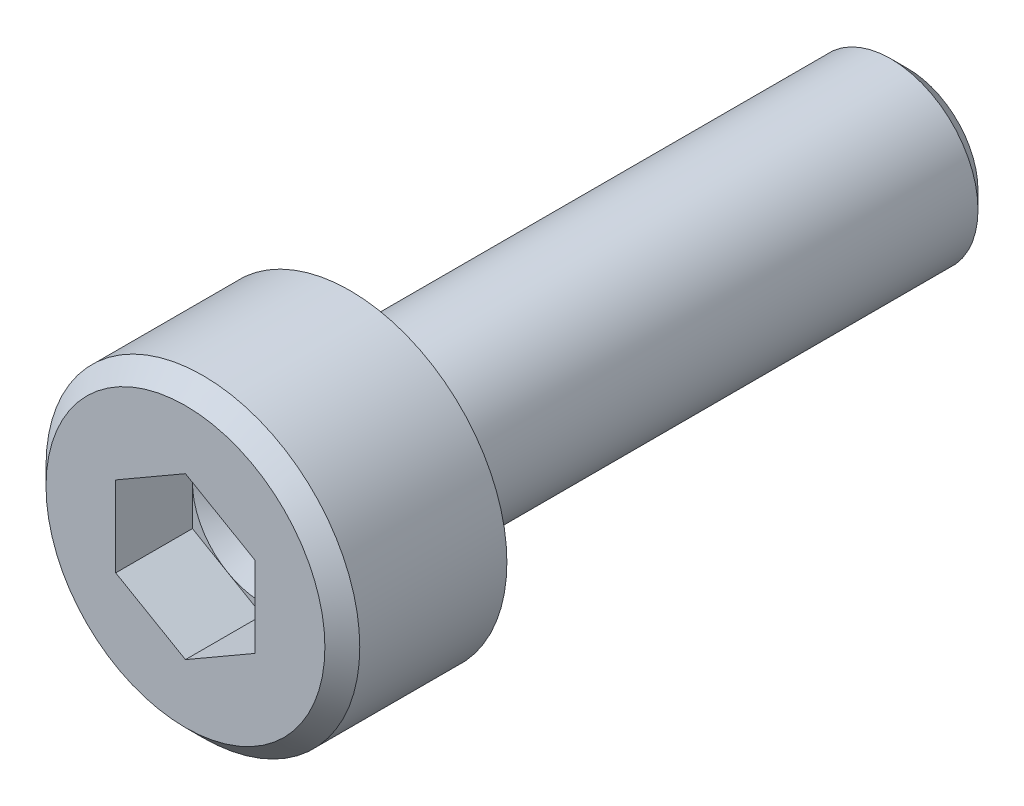
ISO-10303-21;
HEADER;
FILE_DESCRIPTION(('STEP AP214'),'2;1');
FILE_NAME('part.step','',(''),(''),'','','');
FILE_SCHEMA(('AUTOMOTIVE_DESIGN { 1 0 10303 214 1 1 1 1 }'));
ENDSEC;
DATA;
#1=APPLICATION_CONTEXT('core data for automotive mechanical design processes');
#2=APPLICATION_PROTOCOL_DEFINITION('international standard','automotive_design',2000,#1);
#3=PRODUCT_CONTEXT('',#1,'mechanical');
#4=PRODUCT('Part','Part','',(#3));
#5=PRODUCT_RELATED_PRODUCT_CATEGORY('part','',(#4));
#6=PRODUCT_DEFINITION_FORMATION('','',#4);
#7=PRODUCT_DEFINITION_CONTEXT('part definition',#1,'design');
#8=PRODUCT_DEFINITION('design','',#6,#7);
#9=PRODUCT_DEFINITION_SHAPE('','',#8);
#10=(LENGTH_UNIT() NAMED_UNIT(*) SI_UNIT(.MILLI.,.METRE.));
#11=(NAMED_UNIT(*) PLANE_ANGLE_UNIT() SI_UNIT($,.RADIAN.));
#12=(NAMED_UNIT(*) SI_UNIT($,.STERADIAN.) SOLID_ANGLE_UNIT());
#13=UNCERTAINTY_MEASURE_WITH_UNIT(LENGTH_MEASURE(1.E-05),#10,'distance_accuracy_value','');
#14=(GEOMETRIC_REPRESENTATION_CONTEXT(3) GLOBAL_UNCERTAINTY_ASSIGNED_CONTEXT((#13)) GLOBAL_UNIT_ASSIGNED_CONTEXT((#10,
#11,#12)) REPRESENTATION_CONTEXT('',''));
#15=CARTESIAN_POINT('',(0.,0.,0.));
#16=DIRECTION('',(0.,0.,1.));
#17=DIRECTION('',(1.,0.,0.));
#18=AXIS2_PLACEMENT_3D('',#15,#16,#17);
#19=CARTESIAN_POINT('',(27.5,-9.,3.25999999995474));
#20=DIRECTION('',(0.,0.,1.));
#21=DIRECTION('',(1.,0.,0.));
#22=AXIS2_PLACEMENT_3D('',#19,#20,#21);
#23=CONICAL_SURFACE('',#22,0.999999999934061,1.04719755119586);
#24=CARTESIAN_POINT('',(27.5,-9.,2.68264973084342));
#25=VERTEX_POINT('',#24);
#26=VERTEX_LOOP('',#25);
#27=FACE_BOUND('',#26,.T.);
#28=CARTESIAN_POINT('',(27.5,-9.,3.25999999998756));
#29=DIRECTION('',(0.,0.,1.));
#30=DIRECTION('',(1.,0.,0.));
#31=AXIS2_PLACEMENT_3D('',#28,#29,#30);
#32=CIRCLE('',#31,0.999999999990903);
#33=CARTESIAN_POINT('',(26.5000000000045,-9.,3.25999999999378));
#34=VERTEX_POINT('',#33);
#35=CARTESIAN_POINT('',(27.,-9.86602540378444,3.25999999998958));
#36=VERTEX_POINT('',#35);
#37=EDGE_CURVE('E19',#34,#36,#32,.T.);
#38=ORIENTED_EDGE('',*,*,#37,.T.);
#39=CARTESIAN_POINT('',(27.5,-9.,3.25999999998756));
#40=DIRECTION('',(0.,0.,1.));
#41=DIRECTION('',(1.,0.,0.));
#42=AXIS2_PLACEMENT_3D('',#39,#40,#41);
#43=CIRCLE('',#42,0.999999999990903);
#44=CARTESIAN_POINT('',(27.9999999999977,-9.86602540378052,3.25999999999378));
#45=VERTEX_POINT('',#44);
#46=EDGE_CURVE('E93',#36,#45,#43,.T.);
#47=ORIENTED_EDGE('',*,*,#46,.T.);
#48=CARTESIAN_POINT('',(27.5,-9.,3.25999999998756));
#49=DIRECTION('',(0.,0.,1.));
#50=DIRECTION('',(1.,0.,0.));
#51=AXIS2_PLACEMENT_3D('',#48,#49,#50);
#52=CIRCLE('',#51,0.999999999990904);
#53=CARTESIAN_POINT('',(28.4999999999955,-9.,3.25999999999378));
#54=VERTEX_POINT('',#53);
#55=EDGE_CURVE('E102',#45,#54,#52,.T.);
#56=ORIENTED_EDGE('',*,*,#55,.T.);
#57=CARTESIAN_POINT('',(27.5,-9.,3.25999999998756));
#58=DIRECTION('',(0.,0.,1.));
#59=DIRECTION('',(1.,0.,0.));
#60=AXIS2_PLACEMENT_3D('',#57,#58,#59);
#61=CIRCLE('',#60,0.999999999990905);
#62=CARTESIAN_POINT('',(27.9999999999977,-8.1339745962195,3.25999999999378));
#63=VERTEX_POINT('',#62);
#64=EDGE_CURVE('E204',#54,#63,#61,.T.);
#65=ORIENTED_EDGE('',*,*,#64,.T.);
#66=CARTESIAN_POINT('',(27.5,-9.,3.25999999998756));
#67=DIRECTION('',(0.,0.,1.));
#68=DIRECTION('',(1.,0.,0.));
#69=AXIS2_PLACEMENT_3D('',#66,#67,#68);
#70=CIRCLE('',#69,0.999999999990905);
#71=CARTESIAN_POINT('',(27.0000000000023,-8.1339745962195,3.25999999999378));
#72=VERTEX_POINT('',#71);
#73=EDGE_CURVE('E207',#63,#72,#70,.T.);
#74=ORIENTED_EDGE('',*,*,#73,.T.);
#75=CARTESIAN_POINT('',(27.5,-9.,3.25999999998756));
#76=DIRECTION('',(0.,0.,1.));
#77=DIRECTION('',(1.,0.,0.));
#78=AXIS2_PLACEMENT_3D('',#75,#76,#77);
#79=CIRCLE('',#78,0.999999999990904);
#80=EDGE_CURVE('E88',#72,#34,#79,.T.);
#81=ORIENTED_EDGE('',*,*,#80,.T.);
#82=EDGE_LOOP('',(#38,#47,#56,#65,#74,#81));
#83=FACE_BOUND('',#82,.T.);
#84=ADVANCED_FACE('F16',(#27,#83),#23,.F.);
#85=CARTESIAN_POINT('',(27.5,-9.,3.26));
#86=DIRECTION('',(0.,0.,-1.));
#87=DIRECTION('',(-1.,0.,0.));
#88=AXIS2_PLACEMENT_3D('',#85,#86,#87);
#89=PLANE('',#88);
#90=DIRECTION('',(0.,1.,0.));
#91=VECTOR('',#90,1.);
#92=CARTESIAN_POINT('',(26.5,-8.42264973081037,3.26));
#93=LINE('',#92,#91);
#94=CARTESIAN_POINT('',(26.5,-9.57735026918963,3.26));
#95=VERTEX_POINT('',#94);
#96=EDGE_CURVE('E111',#34,#95,#93,.F.);
#97=ORIENTED_EDGE('',*,*,#96,.T.);
#98=DIRECTION('',(0.866025403784439,-0.5,0.));
#99=VECTOR('',#98,1.);
#100=CARTESIAN_POINT('',(26.5,-9.57735026918963,3.26));
#101=LINE('',#100,#99);
#102=EDGE_CURVE('E108',#95,#36,#101,.T.);
#103=ORIENTED_EDGE('',*,*,#102,.T.);
#104=ORIENTED_EDGE('',*,*,#37,.F.);
#105=EDGE_LOOP('',(#97,#103,#104));
#106=FACE_BOUND('',#105,.T.);
#107=ADVANCED_FACE('F109',(#106),#89,.F.);
#108=CARTESIAN_POINT('',(27.5,-9.,3.26));
#109=DIRECTION('',(0.,0.,-1.));
#110=DIRECTION('',(-1.,0.,0.));
#111=AXIS2_PLACEMENT_3D('',#108,#109,#110);
#112=PLANE('',#111);
#113=DIRECTION('',(-0.866025403784439,-0.5,0.));
#114=VECTOR('',#113,1.);
#115=CARTESIAN_POINT('',(27.5,-7.84529946162075,3.26));
#116=LINE('',#115,#114);
#117=CARTESIAN_POINT('',(26.5,-8.42264973081037,3.26));
#118=VERTEX_POINT('',#117);
#119=EDGE_CURVE('E174',#72,#118,#116,.T.);
#120=ORIENTED_EDGE('',*,*,#119,.T.);
#121=DIRECTION('',(0.,1.,0.));
#122=VECTOR('',#121,1.);
#123=CARTESIAN_POINT('',(26.5,-8.42264973081037,3.26));
#124=LINE('',#123,#122);
#125=EDGE_CURVE('E176',#118,#34,#124,.F.);
#126=ORIENTED_EDGE('',*,*,#125,.T.);
#127=ORIENTED_EDGE('',*,*,#80,.F.);
#128=EDGE_LOOP('',(#120,#126,#127));
#129=FACE_BOUND('',#128,.T.);
#130=ADVANCED_FACE('F211',(#129),#112,.F.);
#131=CARTESIAN_POINT('',(27.5,-9.,3.26));
#132=DIRECTION('',(0.,0.,-1.));
#133=DIRECTION('',(-1.,0.,0.));
#134=AXIS2_PLACEMENT_3D('',#131,#132,#133);
#135=PLANE('',#134);
#136=ORIENTED_EDGE('',*,*,#73,.F.);
#137=DIRECTION('',(-0.866025403784439,0.5,0.));
#138=VECTOR('',#137,1.);
#139=CARTESIAN_POINT('',(28.5,-8.42264973081037,3.26));
#140=LINE('',#139,#138);
#141=CARTESIAN_POINT('',(27.5,-7.84529946162075,3.26));
#142=VERTEX_POINT('',#141);
#143=EDGE_CURVE('E161',#63,#142,#140,.T.);
#144=ORIENTED_EDGE('',*,*,#143,.T.);
#145=DIRECTION('',(-0.866025403784439,-0.5,0.));
#146=VECTOR('',#145,1.);
#147=CARTESIAN_POINT('',(27.5,-7.84529946162075,3.26));
#148=LINE('',#147,#146);
#149=EDGE_CURVE('E163',#142,#72,#148,.T.);
#150=ORIENTED_EDGE('',*,*,#149,.T.);
#151=EDGE_LOOP('',(#136,#144,#150));
#152=FACE_BOUND('',#151,.T.);
#153=ADVANCED_FACE('F215',(#152),#135,.F.);
#154=CARTESIAN_POINT('',(27.5,-9.,3.26));
#155=DIRECTION('',(0.,0.,-1.));
#156=DIRECTION('',(-1.,0.,0.));
#157=AXIS2_PLACEMENT_3D('',#154,#155,#156);
#158=PLANE('',#157);
#159=DIRECTION('',(0.,1.,0.));
#160=VECTOR('',#159,1.);
#161=CARTESIAN_POINT('',(28.5,-9.57735026918963,3.26));
#162=LINE('',#161,#160);
#163=CARTESIAN_POINT('',(28.5,-8.42264973081037,3.26));
#164=VERTEX_POINT('',#163);
#165=EDGE_CURVE('E148',#54,#164,#162,.T.);
#166=ORIENTED_EDGE('',*,*,#165,.T.);
#167=DIRECTION('',(-0.866025403784439,0.5,0.));
#168=VECTOR('',#167,1.);
#169=CARTESIAN_POINT('',(28.5,-8.42264973081037,3.26));
#170=LINE('',#169,#168);
#171=EDGE_CURVE('E150',#164,#63,#170,.T.);
#172=ORIENTED_EDGE('',*,*,#171,.T.);
#173=ORIENTED_EDGE('',*,*,#64,.F.);
#174=EDGE_LOOP('',(#166,#172,#173));
#175=FACE_BOUND('',#174,.T.);
#176=ADVANCED_FACE('F255',(#175),#158,.F.);
#177=CARTESIAN_POINT('',(27.5,-9.,3.26));
#178=DIRECTION('',(0.,0.,-1.));
#179=DIRECTION('',(-1.,0.,0.));
#180=AXIS2_PLACEMENT_3D('',#177,#178,#179);
#181=PLANE('',#180);
#182=DIRECTION('',(0.866025403784439,0.5,0.));
#183=VECTOR('',#182,1.);
#184=CARTESIAN_POINT('',(27.5,-10.1547005383793,3.26));
#185=LINE('',#184,#183);
#186=CARTESIAN_POINT('',(28.5,-9.57735026918966,3.26));
#187=VERTEX_POINT('',#186);
#188=EDGE_CURVE('E141',#45,#187,#185,.T.);
#189=ORIENTED_EDGE('',*,*,#188,.T.);
#190=DIRECTION('',(0.,1.,0.));
#191=VECTOR('',#190,1.);
#192=CARTESIAN_POINT('',(28.5,-9.57735026918963,3.26));
#193=LINE('',#192,#191);
#194=EDGE_CURVE('E138',#187,#54,#193,.T.);
#195=ORIENTED_EDGE('',*,*,#194,.T.);
#196=ORIENTED_EDGE('',*,*,#55,.F.);
#197=EDGE_LOOP('',(#189,#195,#196));
#198=FACE_BOUND('',#197,.T.);
#199=ADVANCED_FACE('F250',(#198),#181,.F.);
#200=CARTESIAN_POINT('',(27.5,-9.,3.26));
#201=DIRECTION('',(0.,0.,-1.));
#202=DIRECTION('',(-1.,0.,0.));
#203=AXIS2_PLACEMENT_3D('',#200,#201,#202);
#204=PLANE('',#203);
#205=ORIENTED_EDGE('',*,*,#46,.F.);
#206=DIRECTION('',(0.866025403784439,-0.5,0.));
#207=VECTOR('',#206,1.);
#208=CARTESIAN_POINT('',(26.5,-9.57735026918963,3.26));
#209=LINE('',#208,#207);
#210=CARTESIAN_POINT('',(27.5,-10.1547005383793,3.26));
#211=VERTEX_POINT('',#210);
#212=EDGE_CURVE('E96',#36,#211,#209,.T.);
#213=ORIENTED_EDGE('',*,*,#212,.T.);
#214=DIRECTION('',(0.866025403784439,0.5,0.));
#215=VECTOR('',#214,1.);
#216=CARTESIAN_POINT('',(27.5,-10.1547005383793,3.26));
#217=LINE('',#216,#215);
#218=EDGE_CURVE('E99',#211,#45,#217,.T.);
#219=ORIENTED_EDGE('',*,*,#218,.T.);
#220=EDGE_LOOP('',(#205,#213,#219));
#221=FACE_BOUND('',#220,.T.);
#222=ADVANCED_FACE('F94',(#221),#204,.F.);
#223=CARTESIAN_POINT('',(26.5,-9.57735026918963,4.36));
#224=DIRECTION('',(-0.5,-0.866025403784439,0.));
#225=DIRECTION('',(0.866025403784439,-0.5,0.));
#226=AXIS2_PLACEMENT_3D('',#223,#224,#225);
#227=PLANE('',#226);
#228=DIRECTION('',(0.,0.,1.));
#229=VECTOR('',#228,1.);
#230=CARTESIAN_POINT('',(26.5,-9.57735026918963,4.36));
#231=LINE('',#230,#229);
#232=CARTESIAN_POINT('',(26.5,-9.57735026918963,4.36));
#233=VERTEX_POINT('',#232);
#234=EDGE_CURVE('E180',#95,#233,#231,.T.);
#235=ORIENTED_EDGE('',*,*,#234,.T.);
#236=DIRECTION('',(-0.866025403784422,0.500000000000028,0.));
#237=VECTOR('',#236,1.);
#238=CARTESIAN_POINT('',(27.5,-10.1547005383793,4.36));
#239=LINE('',#238,#237);
#240=CARTESIAN_POINT('',(27.5,-10.1547005383793,4.36));
#241=VERTEX_POINT('',#240);
#242=EDGE_CURVE('E125',#241,#233,#239,.T.);
#243=ORIENTED_EDGE('',*,*,#242,.F.);
#244=DIRECTION('',(0.,0.,1.));
#245=VECTOR('',#244,1.);
#246=CARTESIAN_POINT('',(27.5,-10.1547005383793,4.36));
#247=LINE('',#246,#245);
#248=EDGE_CURVE('E117',#241,#211,#247,.F.);
#249=ORIENTED_EDGE('',*,*,#248,.T.);
#250=ORIENTED_EDGE('',*,*,#212,.F.);
#251=ORIENTED_EDGE('',*,*,#102,.F.);
#252=EDGE_LOOP('',(#235,#243,#249,#250,#251));
#253=FACE_BOUND('',#252,.T.);
#254=ADVANCED_FACE('F115',(#253),#227,.F.);
#255=CARTESIAN_POINT('',(26.5,-8.42264973081037,4.36));
#256=DIRECTION('',(-1.,0.,0.));
#257=DIRECTION('',(0.,0.,1.));
#258=AXIS2_PLACEMENT_3D('',#255,#256,#257);
#259=PLANE('',#258);
#260=DIRECTION('',(0.,0.,1.));
#261=VECTOR('',#260,1.);
#262=CARTESIAN_POINT('',(26.5,-8.42264973081038,4.36));
#263=LINE('',#262,#261);
#264=CARTESIAN_POINT('',(26.5,-8.42264973081037,4.36));
#265=VERTEX_POINT('',#264);
#266=EDGE_CURVE('E168',#118,#265,#263,.T.);
#267=ORIENTED_EDGE('',*,*,#266,.T.);
#268=DIRECTION('',(0.,1.,0.));
#269=VECTOR('',#268,1.);
#270=CARTESIAN_POINT('',(26.5,-10.,4.36));
#271=LINE('',#270,#269);
#272=EDGE_CURVE('E128',#233,#265,#271,.T.);
#273=ORIENTED_EDGE('',*,*,#272,.F.);
#274=ORIENTED_EDGE('',*,*,#234,.F.);
#275=ORIENTED_EDGE('',*,*,#96,.F.);
#276=ORIENTED_EDGE('',*,*,#125,.F.);
#277=EDGE_LOOP('',(#267,#273,#274,#275,#276));
#278=FACE_BOUND('',#277,.T.);
#279=ADVANCED_FACE('F227',(#278),#259,.F.);
#280=CARTESIAN_POINT('',(27.5,-7.84529946162075,4.36));
#281=DIRECTION('',(-0.5,0.866025403784439,0.));
#282=DIRECTION('',(-0.866025403784439,-0.5,0.));
#283=AXIS2_PLACEMENT_3D('',#280,#281,#282);
#284=PLANE('',#283);
#285=DIRECTION('',(0.,0.,1.));
#286=VECTOR('',#285,1.);
#287=CARTESIAN_POINT('',(27.5,-7.84529946162074,4.36));
#288=LINE('',#287,#286);
#289=CARTESIAN_POINT('',(27.5,-7.84529946162075,4.36));
#290=VERTEX_POINT('',#289);
#291=EDGE_CURVE('E155',#142,#290,#288,.T.);
#292=ORIENTED_EDGE('',*,*,#291,.T.);
#293=DIRECTION('',(0.866025403784441,0.499999999999996,0.));
#294=VECTOR('',#293,1.);
#295=CARTESIAN_POINT('',(26.5,-8.42264973081037,4.36));
#296=LINE('',#295,#294);
#297=EDGE_CURVE('E223',#265,#290,#296,.T.);
#298=ORIENTED_EDGE('',*,*,#297,.F.);
#299=ORIENTED_EDGE('',*,*,#266,.F.);
#300=ORIENTED_EDGE('',*,*,#119,.F.);
#301=ORIENTED_EDGE('',*,*,#149,.F.);
#302=EDGE_LOOP('',(#292,#298,#299,#300,#301));
#303=FACE_BOUND('',#302,.T.);
#304=ADVANCED_FACE('F220',(#303),#284,.F.);
#305=CARTESIAN_POINT('',(28.5,-8.42264973081037,4.36));
#306=DIRECTION('',(0.5,0.866025403784439,0.));
#307=DIRECTION('',(-0.866025403784439,0.5,0.));
#308=AXIS2_PLACEMENT_3D('',#305,#306,#307);
#309=PLANE('',#308);
#310=DIRECTION('',(0.,0.,-1.));
#311=VECTOR('',#310,1.);
#312=CARTESIAN_POINT('',(28.5,-8.42264973081037,4.36));
#313=LINE('',#312,#311);
#314=CARTESIAN_POINT('',(28.5,-8.42264973081037,4.36));
#315=VERTEX_POINT('',#314);
#316=EDGE_CURVE('E142',#164,#315,#313,.F.);
#317=ORIENTED_EDGE('',*,*,#316,.T.);
#318=DIRECTION('',(0.866025403784441,-0.499999999999996,0.));
#319=VECTOR('',#318,1.);
#320=CARTESIAN_POINT('',(27.5,-7.84529946162075,4.36));
#321=LINE('',#320,#319);
#322=EDGE_CURVE('E235',#290,#315,#321,.T.);
#323=ORIENTED_EDGE('',*,*,#322,.F.);
#324=ORIENTED_EDGE('',*,*,#291,.F.);
#325=ORIENTED_EDGE('',*,*,#143,.F.);
#326=ORIENTED_EDGE('',*,*,#171,.F.);
#327=EDGE_LOOP('',(#317,#323,#324,#325,#326));
#328=FACE_BOUND('',#327,.T.);
#329=ADVANCED_FACE('F257',(#328),#309,.F.);
#330=CARTESIAN_POINT('',(28.5,-9.57735026918963,4.36));
#331=DIRECTION('',(1.,0.,0.));
#332=DIRECTION('',(0.,0.,-1.));
#333=AXIS2_PLACEMENT_3D('',#330,#331,#332);
#334=PLANE('',#333);
#335=DIRECTION('',(0.,0.,1.));
#336=VECTOR('',#335,1.);
#337=CARTESIAN_POINT('',(28.5,-9.57735026918966,4.36));
#338=LINE('',#337,#336);
#339=CARTESIAN_POINT('',(28.5,-9.57735026918964,4.36));
#340=VERTEX_POINT('',#339);
#341=EDGE_CURVE('E34',#187,#340,#338,.T.);
#342=ORIENTED_EDGE('',*,*,#341,.T.);
#343=DIRECTION('',(0.,1.,0.));
#344=VECTOR('',#343,1.);
#345=CARTESIAN_POINT('',(28.5,-10.,4.36));
#346=LINE('',#345,#344);
#347=EDGE_CURVE('E135',#315,#340,#346,.F.);
#348=ORIENTED_EDGE('',*,*,#347,.F.);
#349=ORIENTED_EDGE('',*,*,#316,.F.);
#350=ORIENTED_EDGE('',*,*,#165,.F.);
#351=ORIENTED_EDGE('',*,*,#194,.F.);
#352=EDGE_LOOP('',(#342,#348,#349,#350,#351));
#353=FACE_BOUND('',#352,.T.);
#354=ADVANCED_FACE('F252',(#353),#334,.F.);
#355=CARTESIAN_POINT('',(27.5,-10.1547005383793,4.36));
#356=DIRECTION('',(0.5,-0.866025403784439,0.));
#357=DIRECTION('',(0.866025403784439,0.5,0.));
#358=AXIS2_PLACEMENT_3D('',#355,#356,#357);
#359=PLANE('',#358);
#360=ORIENTED_EDGE('',*,*,#248,.F.);
#361=DIRECTION('',(-0.866025403784422,-0.500000000000028,0.));
#362=VECTOR('',#361,1.);
#363=CARTESIAN_POINT('',(28.5,-9.57735026918963,4.36));
#364=LINE('',#363,#362);
#365=EDGE_CURVE('E131',#340,#241,#364,.T.);
#366=ORIENTED_EDGE('',*,*,#365,.F.);
#367=ORIENTED_EDGE('',*,*,#341,.F.);
#368=ORIENTED_EDGE('',*,*,#188,.F.);
#369=ORIENTED_EDGE('',*,*,#218,.F.);
#370=EDGE_LOOP('',(#360,#366,#367,#368,#369));
#371=FACE_BOUND('',#370,.T.);
#372=ADVANCED_FACE('F230',(#371),#359,.F.);
#373=CARTESIAN_POINT('',(27.5,-10.,4.36));
#374=DIRECTION('',(0.,0.,1.));
#375=DIRECTION('',(1.,0.,0.));
#376=AXIS2_PLACEMENT_3D('',#373,#374,#375);
#377=PLANE('',#376);
#378=CARTESIAN_POINT('',(27.5,-9.,4.36000000001968));
#379=DIRECTION('',(0.,0.,-1.));
#380=DIRECTION('',(-1.,0.,0.));
#381=AXIS2_PLACEMENT_3D('',#378,#379,#380);
#382=CIRCLE('',#381,1.99999999996726);
#383=CARTESIAN_POINT('',(25.5000000000327,-9.,4.36000000001968));
#384=VERTEX_POINT('',#383);
#385=EDGE_CURVE('E134',#384,#384,#382,.T.);
#386=ORIENTED_EDGE('',*,*,#385,.F.);
#387=EDGE_LOOP('',(#386));
#388=FACE_BOUND('',#387,.T.);
#389=ORIENTED_EDGE('',*,*,#347,.T.);
#390=ORIENTED_EDGE('',*,*,#365,.T.);
#391=ORIENTED_EDGE('',*,*,#242,.T.);
#392=ORIENTED_EDGE('',*,*,#272,.T.);
#393=ORIENTED_EDGE('',*,*,#297,.T.);
#394=ORIENTED_EDGE('',*,*,#322,.T.);
#395=EDGE_LOOP('',(#389,#390,#391,#392,#393,#394));
#396=FACE_BOUND('',#395,.T.);
#397=ADVANCED_FACE('F232',(#388,#396),#377,.T.);
#398=CARTESIAN_POINT('',(27.5,-9.,4.11000000002559));
#399=DIRECTION('',(0.,0.,-1.));
#400=DIRECTION('',(-1.,0.,0.));
#401=AXIS2_PLACEMENT_3D('',#398,#399,#400);
#402=CONICAL_SURFACE('',#401,2.24999999996135,0.785398163397448);
#403=ORIENTED_EDGE('',*,*,#385,.T.);
#404=EDGE_LOOP('',(#403));
#405=FACE_BOUND('',#404,.T.);
#406=CARTESIAN_POINT('',(27.5,-9.,4.11));
#407=DIRECTION('',(0.,0.,-1.));
#408=DIRECTION('',(-1.,0.,0.));
#409=AXIS2_PLACEMENT_3D('',#406,#407,#408);
#410=CIRCLE('',#409,2.25);
#411=CARTESIAN_POINT('',(25.25,-9.,4.11));
#412=VERTEX_POINT('',#411);
#413=EDGE_CURVE('E200',#412,#412,#410,.T.);
#414=ORIENTED_EDGE('',*,*,#413,.F.);
#415=EDGE_LOOP('',(#414));
#416=FACE_BOUND('',#415,.T.);
#417=ADVANCED_FACE('F291',(#405,#416),#402,.T.);
#418=CARTESIAN_POINT('',(27.5,-9.50325,-6.));
#419=DIRECTION('',(0.,0.,-1.));
#420=DIRECTION('',(-1.,0.,0.));
#421=AXIS2_PLACEMENT_3D('',#418,#419,#420);
#422=PLANE('',#421);
#423=CARTESIAN_POINT('',(27.5,-9.,-5.99999999997181));
#424=DIRECTION('',(0.,0.,1.));
#425=DIRECTION('',(1.,0.,0.));
#426=AXIS2_PLACEMENT_3D('',#423,#424,#425);
#427=CIRCLE('',#426,1.00650000003134);
#428=CARTESIAN_POINT('',(28.5065000000313,-9.,-5.99999999997181));
#429=VERTEX_POINT('',#428);
#430=EDGE_CURVE('E197',#429,#429,#427,.T.);
#431=ORIENTED_EDGE('',*,*,#430,.F.);
#432=EDGE_LOOP('',(#431));
#433=FACE_BOUND('',#432,.T.);
#434=ADVANCED_FACE('F287',(#433),#422,.T.);
#435=CARTESIAN_POINT('',(27.5,-9.,3.055));
#436=DIRECTION('',(0.,0.,-1.));
#437=DIRECTION('',(-1.,0.,0.));
#438=AXIS2_PLACEMENT_3D('',#435,#436,#437);
#439=CYLINDRICAL_SURFACE('',#438,2.25);
#440=ORIENTED_EDGE('',*,*,#413,.T.);
#441=EDGE_LOOP('',(#440));
#442=FACE_BOUND('',#441,.T.);
#443=CARTESIAN_POINT('',(27.5,-9.,2.));
#444=DIRECTION('',(0.,0.,-1.));
#445=DIRECTION('',(-1.,0.,0.));
#446=AXIS2_PLACEMENT_3D('',#443,#444,#445);
#447=CIRCLE('',#446,2.25);
#448=CARTESIAN_POINT('',(25.25,-9.,2.));
#449=VERTEX_POINT('',#448);
#450=EDGE_CURVE('E194',#449,#449,#447,.T.);
#451=ORIENTED_EDGE('',*,*,#450,.F.);
#452=EDGE_LOOP('',(#451));
#453=FACE_BOUND('',#452,.T.);
#454=ADVANCED_FACE('F283',(#442,#453),#439,.T.);
#455=CARTESIAN_POINT('',(27.5,-9.,-5.75649999996131));
#456=DIRECTION('',(0.,0.,1.));
#457=DIRECTION('',(1.,0.,0.));
#458=AXIS2_PLACEMENT_3D('',#455,#456,#457);
#459=CONICAL_SURFACE('',#458,1.25000000004184,0.785398163397448);
#460=ORIENTED_EDGE('',*,*,#430,.T.);
#461=EDGE_LOOP('',(#460));
#462=FACE_BOUND('',#461,.T.);
#463=CARTESIAN_POINT('',(27.5,-9.,-5.7565));
#464=DIRECTION('',(0.,0.,-1.));
#465=DIRECTION('',(-1.,0.,0.));
#466=AXIS2_PLACEMENT_3D('',#463,#464,#465);
#467=CIRCLE('',#466,1.25);
#468=CARTESIAN_POINT('',(26.25,-9.,-5.7565));
#469=VERTEX_POINT('',#468);
#470=EDGE_CURVE('E25',#469,#469,#467,.F.);
#471=ORIENTED_EDGE('',*,*,#470,.F.);
#472=EDGE_LOOP('',(#471));
#473=FACE_BOUND('',#472,.T.);
#474=ADVANCED_FACE('F275',(#462,#473),#459,.T.);
#475=CARTESIAN_POINT('',(27.5,-10.75,2.));
#476=DIRECTION('',(0.,0.,-1.));
#477=DIRECTION('',(-1.,0.,0.));
#478=AXIS2_PLACEMENT_3D('',#475,#476,#477);
#479=PLANE('',#478);
#480=CARTESIAN_POINT('',(27.5,-9.,2.));
#481=DIRECTION('',(0.,0.,-1.));
#482=DIRECTION('',(-1.,0.,0.));
#483=AXIS2_PLACEMENT_3D('',#480,#481,#482);
#484=CIRCLE('',#483,1.25);
#485=CARTESIAN_POINT('',(26.25,-9.,2.));
#486=VERTEX_POINT('',#485);
#487=EDGE_CURVE('E11',#486,#486,#484,.T.);
#488=ORIENTED_EDGE('',*,*,#487,.F.);
#489=EDGE_LOOP('',(#488));
#490=FACE_BOUND('',#489,.T.);
#491=ORIENTED_EDGE('',*,*,#450,.T.);
#492=EDGE_LOOP('',(#491));
#493=FACE_BOUND('',#492,.T.);
#494=ADVANCED_FACE('F269',(#490,#493),#479,.T.);
#495=CARTESIAN_POINT('',(27.5,-9.,-1.87825));
#496=DIRECTION('',(0.,0.,-1.));
#497=DIRECTION('',(-1.,0.,0.));
#498=AXIS2_PLACEMENT_3D('',#495,#496,#497);
#499=CYLINDRICAL_SURFACE('',#498,1.25);
#500=ORIENTED_EDGE('',*,*,#470,.T.);
#501=EDGE_LOOP('',(#500));
#502=FACE_BOUND('',#501,.T.);
#503=ORIENTED_EDGE('',*,*,#487,.T.);
#504=EDGE_LOOP('',(#503));
#505=FACE_BOUND('',#504,.T.);
#506=ADVANCED_FACE('F267',(#502,#505),#499,.T.);
#507=CLOSED_SHELL('',(#84,#107,#130,#153,#176,#199,#222,#254,#279,#304,#329,#354,#372,#397,#417,
#434,#454,#474,#494,#506));
#508=MANIFOLD_SOLID_BREP('B1',#507);
#509=ADVANCED_BREP_SHAPE_REPRESENTATION('',(#18,#508),#14);
#510=SHAPE_DEFINITION_REPRESENTATION(#9,#509);
ENDSEC;
END-ISO-10303-21;
